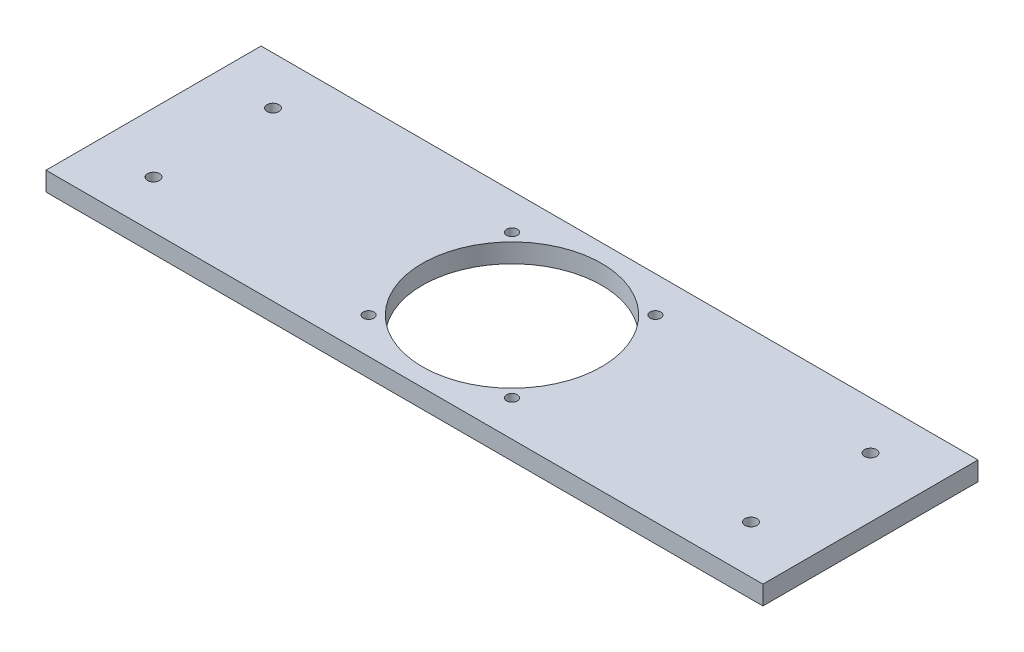
ISO-10303-21;
HEADER;
FILE_DESCRIPTION(('STEP AP214'),'2;1');
FILE_NAME('part.step','',(''),(''),'','','');
FILE_SCHEMA(('AUTOMOTIVE_DESIGN { 1 0 10303 214 1 1 1 1 }'));
ENDSEC;
DATA;
#1=APPLICATION_CONTEXT('core data for automotive mechanical design processes');
#2=APPLICATION_PROTOCOL_DEFINITION('international standard','automotive_design',2000,#1);
#3=PRODUCT_CONTEXT('',#1,'mechanical');
#4=PRODUCT('Part','Part','',(#3));
#5=PRODUCT_RELATED_PRODUCT_CATEGORY('part','',(#4));
#6=PRODUCT_DEFINITION_FORMATION('','',#4);
#7=PRODUCT_DEFINITION_CONTEXT('part definition',#1,'design');
#8=PRODUCT_DEFINITION('design','',#6,#7);
#9=PRODUCT_DEFINITION_SHAPE('','',#8);
#10=(LENGTH_UNIT() NAMED_UNIT(*) SI_UNIT(.MILLI.,.METRE.));
#11=(NAMED_UNIT(*) PLANE_ANGLE_UNIT() SI_UNIT($,.RADIAN.));
#12=(NAMED_UNIT(*) SI_UNIT($,.STERADIAN.) SOLID_ANGLE_UNIT());
#13=UNCERTAINTY_MEASURE_WITH_UNIT(LENGTH_MEASURE(1.E-05),#10,'distance_accuracy_value','');
#14=(GEOMETRIC_REPRESENTATION_CONTEXT(3) GLOBAL_UNCERTAINTY_ASSIGNED_CONTEXT((#13)) GLOBAL_UNIT_ASSIGNED_CONTEXT((#10,
#11,#12)) REPRESENTATION_CONTEXT('',''));
#15=CARTESIAN_POINT('',(0.,0.,0.));
#16=DIRECTION('',(0.,0.,1.));
#17=DIRECTION('',(1.,0.,0.));
#18=AXIS2_PLACEMENT_3D('',#15,#16,#17);
#19=CARTESIAN_POINT('',(-60.,3.175,18.));
#20=DIRECTION('',(1.,0.,0.));
#21=DIRECTION('',(0.,0.,-1.));
#22=AXIS2_PLACEMENT_3D('',#19,#20,#21);
#23=PLANE('',#22);
#24=DIRECTION('',(0.,0.,1.));
#25=VECTOR('',#24,1.);
#26=CARTESIAN_POINT('',(-60.,0.,18.));
#27=LINE('',#26,#25);
#28=CARTESIAN_POINT('',(-60.,0.,-18.));
#29=VERTEX_POINT('',#28);
#30=CARTESIAN_POINT('',(-60.,0.,18.));
#31=VERTEX_POINT('',#30);
#32=EDGE_CURVE('E105',#29,#31,#27,.T.);
#33=ORIENTED_EDGE('',*,*,#32,.T.);
#34=DIRECTION('',(0.,-1.,0.));
#35=VECTOR('',#34,1.);
#36=CARTESIAN_POINT('',(-60.,3.175,18.));
#37=LINE('',#36,#35);
#38=CARTESIAN_POINT('',(-60.,3.175,18.));
#39=VERTEX_POINT('',#38);
#40=EDGE_CURVE('E11',#39,#31,#37,.T.);
#41=ORIENTED_EDGE('',*,*,#40,.F.);
#42=DIRECTION('',(0.,0.,1.));
#43=VECTOR('',#42,1.);
#44=CARTESIAN_POINT('',(-60.,3.175,18.));
#45=LINE('',#44,#43);
#46=CARTESIAN_POINT('',(-60.,3.175,-18.));
#47=VERTEX_POINT('',#46);
#48=EDGE_CURVE('E92',#47,#39,#45,.T.);
#49=ORIENTED_EDGE('',*,*,#48,.F.);
#50=DIRECTION('',(0.,-1.,0.));
#51=VECTOR('',#50,1.);
#52=CARTESIAN_POINT('',(-60.,3.175,-18.));
#53=LINE('',#52,#51);
#54=EDGE_CURVE('E101',#47,#29,#53,.T.);
#55=ORIENTED_EDGE('',*,*,#54,.T.);
#56=EDGE_LOOP('',(#33,#41,#49,#55));
#57=FACE_BOUND('',#56,.T.);
#58=ADVANCED_FACE('F39',(#57),#23,.F.);
#59=CARTESIAN_POINT('',(60.,3.175,18.));
#60=DIRECTION('',(0.,0.,-1.));
#61=DIRECTION('',(-1.,0.,0.));
#62=AXIS2_PLACEMENT_3D('',#59,#60,#61);
#63=PLANE('',#62);
#64=DIRECTION('',(1.,0.,0.));
#65=VECTOR('',#64,1.);
#66=CARTESIAN_POINT('',(60.,0.,18.));
#67=LINE('',#66,#65);
#68=CARTESIAN_POINT('',(60.,0.,18.));
#69=VERTEX_POINT('',#68);
#70=EDGE_CURVE('E96',#31,#69,#67,.T.);
#71=ORIENTED_EDGE('',*,*,#70,.T.);
#72=DIRECTION('',(0.,-1.,0.));
#73=VECTOR('',#72,1.);
#74=CARTESIAN_POINT('',(60.,3.175,18.));
#75=LINE('',#74,#73);
#76=CARTESIAN_POINT('',(60.,3.175,18.));
#77=VERTEX_POINT('',#76);
#78=EDGE_CURVE('E48',#77,#69,#75,.T.);
#79=ORIENTED_EDGE('',*,*,#78,.F.);
#80=DIRECTION('',(1.,0.,0.));
#81=VECTOR('',#80,1.);
#82=CARTESIAN_POINT('',(60.,3.175,18.));
#83=LINE('',#82,#81);
#84=EDGE_CURVE('E87',#39,#77,#83,.T.);
#85=ORIENTED_EDGE('',*,*,#84,.F.);
#86=ORIENTED_EDGE('',*,*,#40,.T.);
#87=EDGE_LOOP('',(#71,#79,#85,#86));
#88=FACE_BOUND('',#87,.T.);
#89=ADVANCED_FACE('F95',(#88),#63,.F.);
#90=CARTESIAN_POINT('',(60.,3.175,18.));
#91=DIRECTION('',(-1.,0.,0.));
#92=DIRECTION('',(0.,0.,1.));
#93=AXIS2_PLACEMENT_3D('',#90,#91,#92);
#94=PLANE('',#93);
#95=DIRECTION('',(0.,0.,-1.));
#96=VECTOR('',#95,1.);
#97=CARTESIAN_POINT('',(60.,0.,18.));
#98=LINE('',#97,#96);
#99=CARTESIAN_POINT('',(60.,0.,-18.));
#100=VERTEX_POINT('',#99);
#101=EDGE_CURVE('E74',#69,#100,#98,.T.);
#102=ORIENTED_EDGE('',*,*,#101,.T.);
#103=DIRECTION('',(0.,-1.,0.));
#104=VECTOR('',#103,1.);
#105=CARTESIAN_POINT('',(60.,3.175,-18.));
#106=LINE('',#105,#104);
#107=CARTESIAN_POINT('',(60.,3.175,-18.));
#108=VERTEX_POINT('',#107);
#109=EDGE_CURVE('E97',#108,#100,#106,.T.);
#110=ORIENTED_EDGE('',*,*,#109,.F.);
#111=DIRECTION('',(0.,0.,-1.));
#112=VECTOR('',#111,1.);
#113=CARTESIAN_POINT('',(60.,3.175,18.));
#114=LINE('',#113,#112);
#115=EDGE_CURVE('E90',#77,#108,#114,.T.);
#116=ORIENTED_EDGE('',*,*,#115,.F.);
#117=ORIENTED_EDGE('',*,*,#78,.T.);
#118=EDGE_LOOP('',(#102,#110,#116,#117));
#119=FACE_BOUND('',#118,.T.);
#120=ADVANCED_FACE('F99',(#119),#94,.F.);
#121=CARTESIAN_POINT('',(60.,3.175,-18.));
#122=DIRECTION('',(0.,0.,1.));
#123=DIRECTION('',(1.,0.,0.));
#124=AXIS2_PLACEMENT_3D('',#121,#122,#123);
#125=PLANE('',#124);
#126=DIRECTION('',(-1.,0.,0.));
#127=VECTOR('',#126,1.);
#128=CARTESIAN_POINT('',(60.,0.,-18.));
#129=LINE('',#128,#127);
#130=EDGE_CURVE('E80',#100,#29,#129,.T.);
#131=ORIENTED_EDGE('',*,*,#130,.T.);
#132=ORIENTED_EDGE('',*,*,#54,.F.);
#133=DIRECTION('',(-1.,0.,0.));
#134=VECTOR('',#133,1.);
#135=CARTESIAN_POINT('',(60.,3.175,-18.));
#136=LINE('',#135,#134);
#137=EDGE_CURVE('E57',#108,#47,#136,.T.);
#138=ORIENTED_EDGE('',*,*,#137,.F.);
#139=ORIENTED_EDGE('',*,*,#109,.T.);
#140=EDGE_LOOP('',(#131,#132,#138,#139));
#141=FACE_BOUND('',#140,.T.);
#142=ADVANCED_FACE('F167',(#141),#125,.F.);
#143=CARTESIAN_POINT('',(0.,3.175,0.));
#144=DIRECTION('',(0.,1.,0.));
#145=DIRECTION('',(0.,0.,1.));
#146=AXIS2_PLACEMENT_3D('',#143,#144,#145);
#147=PLANE('',#146);
#148=CARTESIAN_POINT('',(-50.,3.175,10.));
#149=DIRECTION('',(0.,1.,0.));
#150=DIRECTION('',(0.,0.,1.));
#151=AXIS2_PLACEMENT_3D('',#148,#149,#150);
#152=CIRCLE('',#151,0.999999999999998);
#153=CARTESIAN_POINT('',(-50.,3.175,11.));
#154=VERTEX_POINT('',#153);
#155=EDGE_CURVE('E285',#154,#154,#152,.T.);
#156=ORIENTED_EDGE('',*,*,#155,.F.);
#157=EDGE_LOOP('',(#156));
#158=FACE_BOUND('',#157,.T.);
#159=CARTESIAN_POINT('',(50.,3.175,9.99999999999999));
#160=DIRECTION('',(0.,1.,0.));
#161=DIRECTION('',(0.,0.,1.));
#162=AXIS2_PLACEMENT_3D('',#159,#160,#161);
#163=CIRCLE('',#162,0.999999999999998);
#164=CARTESIAN_POINT('',(50.,3.175,11.));
#165=VERTEX_POINT('',#164);
#166=EDGE_CURVE('E286',#165,#165,#163,.T.);
#167=ORIENTED_EDGE('',*,*,#166,.F.);
#168=EDGE_LOOP('',(#167));
#169=FACE_BOUND('',#168,.T.);
#170=CARTESIAN_POINT('',(50.,3.175,-10.));
#171=DIRECTION('',(0.,1.,0.));
#172=DIRECTION('',(0.,0.,1.));
#173=AXIS2_PLACEMENT_3D('',#170,#171,#172);
#174=CIRCLE('',#173,0.999999999999998);
#175=CARTESIAN_POINT('',(50.,3.175,-9.00000000000001));
#176=VERTEX_POINT('',#175);
#177=EDGE_CURVE('E288',#176,#176,#174,.T.);
#178=ORIENTED_EDGE('',*,*,#177,.F.);
#179=EDGE_LOOP('',(#178));
#180=FACE_BOUND('',#179,.T.);
#181=CARTESIAN_POINT('',(-50.,3.175,-9.99999999999999));
#182=DIRECTION('',(0.,1.,0.));
#183=DIRECTION('',(0.,0.,1.));
#184=AXIS2_PLACEMENT_3D('',#181,#182,#183);
#185=CIRCLE('',#184,0.999999999999998);
#186=CARTESIAN_POINT('',(-50.,3.175,-9.));
#187=VERTEX_POINT('',#186);
#188=EDGE_CURVE('E134',#187,#187,#185,.T.);
#189=ORIENTED_EDGE('',*,*,#188,.F.);
#190=EDGE_LOOP('',(#189));
#191=FACE_BOUND('',#190,.T.);
#192=CARTESIAN_POINT('',(-12.,3.175,-12.));
#193=DIRECTION('',(0.,1.,0.));
#194=DIRECTION('',(0.,0.,1.));
#195=AXIS2_PLACEMENT_3D('',#192,#193,#194);
#196=CIRCLE('',#195,0.9);
#197=CARTESIAN_POINT('',(-12.,3.175,-11.1));
#198=VERTEX_POINT('',#197);
#199=EDGE_CURVE('E150',#198,#198,#196,.T.);
#200=ORIENTED_EDGE('',*,*,#199,.F.);
#201=EDGE_LOOP('',(#200));
#202=FACE_BOUND('',#201,.T.);
#203=CARTESIAN_POINT('',(12.,3.175,12.));
#204=DIRECTION('',(0.,1.,0.));
#205=DIRECTION('',(0.,0.,1.));
#206=AXIS2_PLACEMENT_3D('',#203,#204,#205);
#207=CIRCLE('',#206,0.9);
#208=CARTESIAN_POINT('',(12.,3.175,12.9));
#209=VERTEX_POINT('',#208);
#210=EDGE_CURVE('E145',#209,#209,#207,.T.);
#211=ORIENTED_EDGE('',*,*,#210,.F.);
#212=EDGE_LOOP('',(#211));
#213=FACE_BOUND('',#212,.T.);
#214=CARTESIAN_POINT('',(-12.,3.175,12.));
#215=DIRECTION('',(0.,1.,0.));
#216=DIRECTION('',(0.,0.,1.));
#217=AXIS2_PLACEMENT_3D('',#214,#215,#216);
#218=CIRCLE('',#217,0.9);
#219=CARTESIAN_POINT('',(-12.,3.175,12.9));
#220=VERTEX_POINT('',#219);
#221=EDGE_CURVE('E141',#220,#220,#218,.T.);
#222=ORIENTED_EDGE('',*,*,#221,.F.);
#223=EDGE_LOOP('',(#222));
#224=FACE_BOUND('',#223,.T.);
#225=CARTESIAN_POINT('',(12.,3.175,-12.));
#226=DIRECTION('',(0.,1.,0.));
#227=DIRECTION('',(0.,0.,1.));
#228=AXIS2_PLACEMENT_3D('',#225,#226,#227);
#229=CIRCLE('',#228,0.9);
#230=CARTESIAN_POINT('',(12.,3.175,-11.1));
#231=VERTEX_POINT('',#230);
#232=EDGE_CURVE('E121',#231,#231,#229,.T.);
#233=ORIENTED_EDGE('',*,*,#232,.F.);
#234=EDGE_LOOP('',(#233));
#235=FACE_BOUND('',#234,.T.);
#236=CARTESIAN_POINT('',(0.,3.175,0.));
#237=DIRECTION('',(0.,1.,0.));
#238=DIRECTION('',(0.,0.,1.));
#239=AXIS2_PLACEMENT_3D('',#236,#237,#238);
#240=CIRCLE('',#239,15.);
#241=CARTESIAN_POINT('',(0.,3.175,15.));
#242=VERTEX_POINT('',#241);
#243=EDGE_CURVE('E116',#242,#242,#240,.T.);
#244=ORIENTED_EDGE('',*,*,#243,.F.);
#245=EDGE_LOOP('',(#244));
#246=FACE_BOUND('',#245,.T.);
#247=ORIENTED_EDGE('',*,*,#48,.T.);
#248=ORIENTED_EDGE('',*,*,#84,.T.);
#249=ORIENTED_EDGE('',*,*,#115,.T.);
#250=ORIENTED_EDGE('',*,*,#137,.T.);
#251=EDGE_LOOP('',(#247,#248,#249,#250));
#252=FACE_BOUND('',#251,.T.);
#253=ADVANCED_FACE('F88',(#158,#169,#180,#191,#202,#213,#224,#235,#246,#252),#147,.T.);
#254=CARTESIAN_POINT('',(0.,0.,0.));
#255=DIRECTION('',(0.,1.,0.));
#256=DIRECTION('',(0.,0.,1.));
#257=AXIS2_PLACEMENT_3D('',#254,#255,#256);
#258=PLANE('',#257);
#259=CARTESIAN_POINT('',(-50.,0.,10.));
#260=DIRECTION('',(0.,1.,0.));
#261=DIRECTION('',(0.,0.,1.));
#262=AXIS2_PLACEMENT_3D('',#259,#260,#261);
#263=CIRCLE('',#262,0.999999999999998);
#264=CARTESIAN_POINT('',(-50.,0.,11.));
#265=VERTEX_POINT('',#264);
#266=EDGE_CURVE('E42',#265,#265,#263,.T.);
#267=ORIENTED_EDGE('',*,*,#266,.T.);
#268=EDGE_LOOP('',(#267));
#269=FACE_BOUND('',#268,.T.);
#270=CARTESIAN_POINT('',(50.,0.,9.99999999999999));
#271=DIRECTION('',(0.,1.,0.));
#272=DIRECTION('',(0.,0.,1.));
#273=AXIS2_PLACEMENT_3D('',#270,#271,#272);
#274=CIRCLE('',#273,0.999999999999998);
#275=CARTESIAN_POINT('',(50.,0.,11.));
#276=VERTEX_POINT('',#275);
#277=EDGE_CURVE('E136',#276,#276,#274,.T.);
#278=ORIENTED_EDGE('',*,*,#277,.T.);
#279=EDGE_LOOP('',(#278));
#280=FACE_BOUND('',#279,.T.);
#281=CARTESIAN_POINT('',(50.,0.,-10.));
#282=DIRECTION('',(0.,1.,0.));
#283=DIRECTION('',(0.,0.,1.));
#284=AXIS2_PLACEMENT_3D('',#281,#282,#283);
#285=CIRCLE('',#284,0.999999999999998);
#286=CARTESIAN_POINT('',(50.,0.,-9.00000000000001));
#287=VERTEX_POINT('',#286);
#288=EDGE_CURVE('E133',#287,#287,#285,.T.);
#289=ORIENTED_EDGE('',*,*,#288,.T.);
#290=EDGE_LOOP('',(#289));
#291=FACE_BOUND('',#290,.T.);
#292=CARTESIAN_POINT('',(-50.,0.,-9.99999999999999));
#293=DIRECTION('',(0.,1.,0.));
#294=DIRECTION('',(0.,0.,1.));
#295=AXIS2_PLACEMENT_3D('',#292,#293,#294);
#296=CIRCLE('',#295,0.999999999999998);
#297=CARTESIAN_POINT('',(-50.,0.,-9.));
#298=VERTEX_POINT('',#297);
#299=EDGE_CURVE('E130',#298,#298,#296,.T.);
#300=ORIENTED_EDGE('',*,*,#299,.T.);
#301=EDGE_LOOP('',(#300));
#302=FACE_BOUND('',#301,.T.);
#303=CARTESIAN_POINT('',(-12.,0.,-12.));
#304=DIRECTION('',(0.,1.,0.));
#305=DIRECTION('',(0.,0.,1.));
#306=AXIS2_PLACEMENT_3D('',#303,#304,#305);
#307=CIRCLE('',#306,0.9);
#308=CARTESIAN_POINT('',(-12.,0.,-11.1));
#309=VERTEX_POINT('',#308);
#310=EDGE_CURVE('E127',#309,#309,#307,.T.);
#311=ORIENTED_EDGE('',*,*,#310,.T.);
#312=EDGE_LOOP('',(#311));
#313=FACE_BOUND('',#312,.T.);
#314=CARTESIAN_POINT('',(12.,0.,12.));
#315=DIRECTION('',(0.,1.,0.));
#316=DIRECTION('',(0.,0.,1.));
#317=AXIS2_PLACEMENT_3D('',#314,#315,#316);
#318=CIRCLE('',#317,0.9);
#319=CARTESIAN_POINT('',(12.,0.,12.9));
#320=VERTEX_POINT('',#319);
#321=EDGE_CURVE('E124',#320,#320,#318,.T.);
#322=ORIENTED_EDGE('',*,*,#321,.T.);
#323=EDGE_LOOP('',(#322));
#324=FACE_BOUND('',#323,.T.);
#325=CARTESIAN_POINT('',(-12.,0.,12.));
#326=DIRECTION('',(0.,1.,0.));
#327=DIRECTION('',(0.,0.,1.));
#328=AXIS2_PLACEMENT_3D('',#325,#326,#327);
#329=CIRCLE('',#328,0.9);
#330=CARTESIAN_POINT('',(-12.,0.,12.9));
#331=VERTEX_POINT('',#330);
#332=EDGE_CURVE('E120',#331,#331,#329,.T.);
#333=ORIENTED_EDGE('',*,*,#332,.T.);
#334=EDGE_LOOP('',(#333));
#335=FACE_BOUND('',#334,.T.);
#336=CARTESIAN_POINT('',(12.,0.,-12.));
#337=DIRECTION('',(0.,1.,0.));
#338=DIRECTION('',(0.,0.,1.));
#339=AXIS2_PLACEMENT_3D('',#336,#337,#338);
#340=CIRCLE('',#339,0.9);
#341=CARTESIAN_POINT('',(12.,0.,-11.1));
#342=VERTEX_POINT('',#341);
#343=EDGE_CURVE('E117',#342,#342,#340,.T.);
#344=ORIENTED_EDGE('',*,*,#343,.T.);
#345=EDGE_LOOP('',(#344));
#346=FACE_BOUND('',#345,.T.);
#347=CARTESIAN_POINT('',(0.,0.,0.));
#348=DIRECTION('',(0.,1.,0.));
#349=DIRECTION('',(0.,0.,1.));
#350=AXIS2_PLACEMENT_3D('',#347,#348,#349);
#351=CIRCLE('',#350,15.);
#352=CARTESIAN_POINT('',(0.,0.,15.));
#353=VERTEX_POINT('',#352);
#354=EDGE_CURVE('E108',#353,#353,#351,.T.);
#355=ORIENTED_EDGE('',*,*,#354,.T.);
#356=EDGE_LOOP('',(#355));
#357=FACE_BOUND('',#356,.T.);
#358=ORIENTED_EDGE('',*,*,#32,.F.);
#359=ORIENTED_EDGE('',*,*,#130,.F.);
#360=ORIENTED_EDGE('',*,*,#101,.F.);
#361=ORIENTED_EDGE('',*,*,#70,.F.);
#362=EDGE_LOOP('',(#358,#359,#360,#361));
#363=FACE_BOUND('',#362,.T.);
#364=ADVANCED_FACE('F166',(#269,#280,#291,#302,#313,#324,#335,#346,#357,#363),#258,.F.);
#365=CARTESIAN_POINT('',(0.,-6.825,0.));
#366=DIRECTION('',(0.,1.,0.));
#367=DIRECTION('',(0.,0.,1.));
#368=AXIS2_PLACEMENT_3D('',#365,#366,#367);
#369=CYLINDRICAL_SURFACE('',#368,15.);
#370=ORIENTED_EDGE('',*,*,#243,.T.);
#371=EDGE_LOOP('',(#370));
#372=FACE_BOUND('',#371,.T.);
#373=ORIENTED_EDGE('',*,*,#354,.F.);
#374=EDGE_LOOP('',(#373));
#375=FACE_BOUND('',#374,.T.);
#376=ADVANCED_FACE('F162',(#372,#375),#369,.F.);
#377=CARTESIAN_POINT('',(12.,-6.825,-12.));
#378=DIRECTION('',(0.,1.,0.));
#379=DIRECTION('',(0.,0.,1.));
#380=AXIS2_PLACEMENT_3D('',#377,#378,#379);
#381=CYLINDRICAL_SURFACE('',#380,0.9);
#382=ORIENTED_EDGE('',*,*,#232,.T.);
#383=EDGE_LOOP('',(#382));
#384=FACE_BOUND('',#383,.T.);
#385=ORIENTED_EDGE('',*,*,#343,.F.);
#386=EDGE_LOOP('',(#385));
#387=FACE_BOUND('',#386,.T.);
#388=ADVANCED_FACE('F205',(#384,#387),#381,.F.);
#389=CARTESIAN_POINT('',(-12.,-6.825,12.));
#390=DIRECTION('',(0.,1.,0.));
#391=DIRECTION('',(0.,0.,1.));
#392=AXIS2_PLACEMENT_3D('',#389,#390,#391);
#393=CYLINDRICAL_SURFACE('',#392,0.9);
#394=ORIENTED_EDGE('',*,*,#221,.T.);
#395=EDGE_LOOP('',(#394));
#396=FACE_BOUND('',#395,.T.);
#397=ORIENTED_EDGE('',*,*,#332,.F.);
#398=EDGE_LOOP('',(#397));
#399=FACE_BOUND('',#398,.T.);
#400=ADVANCED_FACE('F213',(#396,#399),#393,.F.);
#401=CARTESIAN_POINT('',(12.,-6.825,12.));
#402=DIRECTION('',(0.,1.,0.));
#403=DIRECTION('',(0.,0.,1.));
#404=AXIS2_PLACEMENT_3D('',#401,#402,#403);
#405=CYLINDRICAL_SURFACE('',#404,0.9);
#406=ORIENTED_EDGE('',*,*,#210,.T.);
#407=EDGE_LOOP('',(#406));
#408=FACE_BOUND('',#407,.T.);
#409=ORIENTED_EDGE('',*,*,#321,.F.);
#410=EDGE_LOOP('',(#409));
#411=FACE_BOUND('',#410,.T.);
#412=ADVANCED_FACE('F222',(#408,#411),#405,.F.);
#413=CARTESIAN_POINT('',(-12.,-6.825,-12.));
#414=DIRECTION('',(0.,1.,0.));
#415=DIRECTION('',(0.,0.,1.));
#416=AXIS2_PLACEMENT_3D('',#413,#414,#415);
#417=CYLINDRICAL_SURFACE('',#416,0.9);
#418=ORIENTED_EDGE('',*,*,#199,.T.);
#419=EDGE_LOOP('',(#418));
#420=FACE_BOUND('',#419,.T.);
#421=ORIENTED_EDGE('',*,*,#310,.F.);
#422=EDGE_LOOP('',(#421));
#423=FACE_BOUND('',#422,.T.);
#424=ADVANCED_FACE('F229',(#420,#423),#417,.F.);
#425=CARTESIAN_POINT('',(-50.,-6.825,-9.99999999999999));
#426=DIRECTION('',(0.,1.,0.));
#427=DIRECTION('',(0.,0.,1.));
#428=AXIS2_PLACEMENT_3D('',#425,#426,#427);
#429=CYLINDRICAL_SURFACE('',#428,0.999999999999998);
#430=ORIENTED_EDGE('',*,*,#188,.T.);
#431=EDGE_LOOP('',(#430));
#432=FACE_BOUND('',#431,.T.);
#433=ORIENTED_EDGE('',*,*,#299,.F.);
#434=EDGE_LOOP('',(#433));
#435=FACE_BOUND('',#434,.T.);
#436=ADVANCED_FACE('F237',(#432,#435),#429,.F.);
#437=CARTESIAN_POINT('',(50.,-6.825,-10.));
#438=DIRECTION('',(0.,1.,0.));
#439=DIRECTION('',(0.,0.,1.));
#440=AXIS2_PLACEMENT_3D('',#437,#438,#439);
#441=CYLINDRICAL_SURFACE('',#440,0.999999999999998);
#442=ORIENTED_EDGE('',*,*,#177,.T.);
#443=EDGE_LOOP('',(#442));
#444=FACE_BOUND('',#443,.T.);
#445=ORIENTED_EDGE('',*,*,#288,.F.);
#446=EDGE_LOOP('',(#445));
#447=FACE_BOUND('',#446,.T.);
#448=ADVANCED_FACE('F250',(#444,#447),#441,.F.);
#449=CARTESIAN_POINT('',(50.,-6.825,9.99999999999999));
#450=DIRECTION('',(0.,1.,0.));
#451=DIRECTION('',(0.,0.,1.));
#452=AXIS2_PLACEMENT_3D('',#449,#450,#451);
#453=CYLINDRICAL_SURFACE('',#452,0.999999999999998);
#454=ORIENTED_EDGE('',*,*,#166,.T.);
#455=EDGE_LOOP('',(#454));
#456=FACE_BOUND('',#455,.T.);
#457=ORIENTED_EDGE('',*,*,#277,.F.);
#458=EDGE_LOOP('',(#457));
#459=FACE_BOUND('',#458,.T.);
#460=ADVANCED_FACE('F260',(#456,#459),#453,.F.);
#461=CARTESIAN_POINT('',(-50.,-6.825,10.));
#462=DIRECTION('',(0.,1.,0.));
#463=DIRECTION('',(0.,0.,1.));
#464=AXIS2_PLACEMENT_3D('',#461,#462,#463);
#465=CYLINDRICAL_SURFACE('',#464,0.999999999999998);
#466=ORIENTED_EDGE('',*,*,#155,.T.);
#467=EDGE_LOOP('',(#466));
#468=FACE_BOUND('',#467,.T.);
#469=ORIENTED_EDGE('',*,*,#266,.F.);
#470=EDGE_LOOP('',(#469));
#471=FACE_BOUND('',#470,.T.);
#472=ADVANCED_FACE('F270',(#468,#471),#465,.F.);
#473=CLOSED_SHELL('',(#58,#89,#120,#142,#253,#364,#376,#388,#400,#412,#424,#436,#448,#460,#472));
#474=MANIFOLD_SOLID_BREP('B2',#473);
#475=ADVANCED_BREP_SHAPE_REPRESENTATION('',(#18,#474),#14);
#476=SHAPE_DEFINITION_REPRESENTATION(#9,#475);
ENDSEC;
END-ISO-10303-21;
